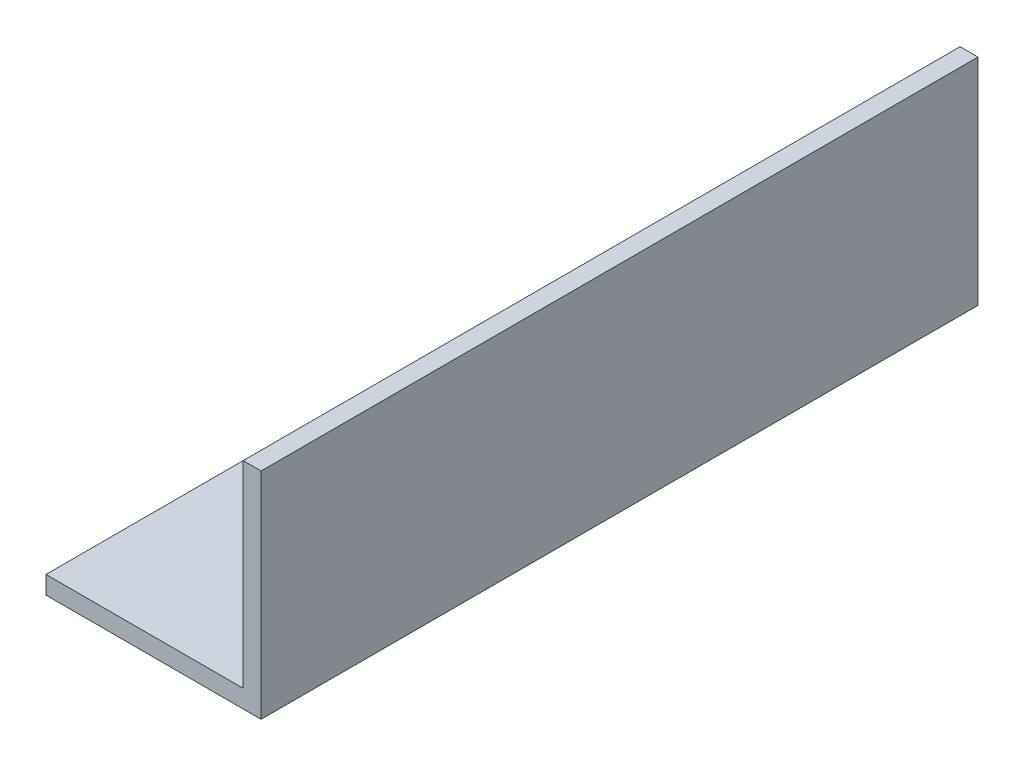
ISO-10303-21;
HEADER;
FILE_DESCRIPTION(('STEP AP214'),'2;1');
FILE_NAME('part.step','',(''),(''),'','','');
FILE_SCHEMA(('AUTOMOTIVE_DESIGN { 1 0 10303 214 1 1 1 1 }'));
ENDSEC;
DATA;
#1=APPLICATION_CONTEXT('core data for automotive mechanical design processes');
#2=APPLICATION_PROTOCOL_DEFINITION('international standard','automotive_design',2000,#1);
#3=PRODUCT_CONTEXT('',#1,'mechanical');
#4=PRODUCT('Part','Part','',(#3));
#5=PRODUCT_RELATED_PRODUCT_CATEGORY('part','',(#4));
#6=PRODUCT_DEFINITION_FORMATION('','',#4);
#7=PRODUCT_DEFINITION_CONTEXT('part definition',#1,'design');
#8=PRODUCT_DEFINITION('design','',#6,#7);
#9=PRODUCT_DEFINITION_SHAPE('','',#8);
#10=(LENGTH_UNIT() NAMED_UNIT(*) SI_UNIT(.MILLI.,.METRE.));
#11=(NAMED_UNIT(*) PLANE_ANGLE_UNIT() SI_UNIT($,.RADIAN.));
#12=(NAMED_UNIT(*) SI_UNIT($,.STERADIAN.) SOLID_ANGLE_UNIT());
#13=UNCERTAINTY_MEASURE_WITH_UNIT(LENGTH_MEASURE(1.E-05),#10,'distance_accuracy_value','');
#14=(GEOMETRIC_REPRESENTATION_CONTEXT(3) GLOBAL_UNCERTAINTY_ASSIGNED_CONTEXT((#13)) GLOBAL_UNIT_ASSIGNED_CONTEXT((#10,
#11,#12)) REPRESENTATION_CONTEXT('',''));
#15=CARTESIAN_POINT('',(0.,0.,0.));
#16=DIRECTION('',(0.,0.,1.));
#17=DIRECTION('',(1.,0.,0.));
#18=AXIS2_PLACEMENT_3D('',#15,#16,#17);
#19=CARTESIAN_POINT('',(0.,0.,127.));
#20=DIRECTION('',(1.,0.,0.));
#21=DIRECTION('',(0.,0.,-1.));
#22=AXIS2_PLACEMENT_3D('',#19,#20,#21);
#23=PLANE('',#22);
#24=DIRECTION('',(0.,-1.,0.));
#25=VECTOR('',#24,1.);
#26=CARTESIAN_POINT('',(0.,0.,127.));
#27=LINE('',#26,#25);
#28=CARTESIAN_POINT('',(0.,3.175,127.));
#29=VERTEX_POINT('',#28);
#30=CARTESIAN_POINT('',(0.,0.,127.));
#31=VERTEX_POINT('',#30);
#32=EDGE_CURVE('E78',#29,#31,#27,.T.);
#33=ORIENTED_EDGE('',*,*,#32,.F.);
#34=DIRECTION('',(0.,0.,1.));
#35=VECTOR('',#34,1.);
#36=CARTESIAN_POINT('',(0.,3.175,0.));
#37=LINE('',#36,#35);
#38=CARTESIAN_POINT('',(0.,3.175,0.));
#39=VERTEX_POINT('',#38);
#40=EDGE_CURVE('E98',#39,#29,#37,.T.);
#41=ORIENTED_EDGE('',*,*,#40,.F.);
#42=DIRECTION('',(0.,-1.,0.));
#43=VECTOR('',#42,1.);
#44=CARTESIAN_POINT('',(0.,0.,0.));
#45=LINE('',#44,#43);
#46=CARTESIAN_POINT('',(0.,0.,0.));
#47=VERTEX_POINT('',#46);
#48=EDGE_CURVE('E106',#39,#47,#45,.T.);
#49=ORIENTED_EDGE('',*,*,#48,.T.);
#50=DIRECTION('',(0.,0.,-1.));
#51=VECTOR('',#50,1.);
#52=CARTESIAN_POINT('',(0.,0.,127.));
#53=LINE('',#52,#51);
#54=EDGE_CURVE('E11',#31,#47,#53,.T.);
#55=ORIENTED_EDGE('',*,*,#54,.F.);
#56=EDGE_LOOP('',(#33,#41,#49,#55));
#57=FACE_BOUND('',#56,.T.);
#58=ADVANCED_FACE('F33',(#57),#23,.F.);
#59=CARTESIAN_POINT('',(0.,0.,127.));
#60=DIRECTION('',(0.,1.,0.));
#61=DIRECTION('',(0.,0.,1.));
#62=AXIS2_PLACEMENT_3D('',#59,#60,#61);
#63=PLANE('',#62);
#64=DIRECTION('',(1.,0.,0.));
#65=VECTOR('',#64,1.);
#66=CARTESIAN_POINT('',(0.,0.,0.));
#67=LINE('',#66,#65);
#68=CARTESIAN_POINT('',(38.1,0.,0.));
#69=VERTEX_POINT('',#68);
#70=EDGE_CURVE('E110',#47,#69,#67,.T.);
#71=ORIENTED_EDGE('',*,*,#70,.T.);
#72=DIRECTION('',(0.,0.,-1.));
#73=VECTOR('',#72,1.);
#74=CARTESIAN_POINT('',(38.1,0.,127.));
#75=LINE('',#74,#73);
#76=CARTESIAN_POINT('',(38.1,0.,127.));
#77=VERTEX_POINT('',#76);
#78=EDGE_CURVE('E40',#77,#69,#75,.T.);
#79=ORIENTED_EDGE('',*,*,#78,.F.);
#80=DIRECTION('',(1.,0.,0.));
#81=VECTOR('',#80,1.);
#82=CARTESIAN_POINT('',(0.,0.,127.));
#83=LINE('',#82,#81);
#84=EDGE_CURVE('E133',#31,#77,#83,.T.);
#85=ORIENTED_EDGE('',*,*,#84,.F.);
#86=ORIENTED_EDGE('',*,*,#54,.T.);
#87=EDGE_LOOP('',(#71,#79,#85,#86));
#88=FACE_BOUND('',#87,.T.);
#89=ADVANCED_FACE('F152',(#88),#63,.F.);
#90=CARTESIAN_POINT('',(38.1,0.,127.));
#91=DIRECTION('',(-1.,0.,0.));
#92=DIRECTION('',(0.,0.,1.));
#93=AXIS2_PLACEMENT_3D('',#90,#91,#92);
#94=PLANE('',#93);
#95=DIRECTION('',(0.,1.,0.));
#96=VECTOR('',#95,1.);
#97=CARTESIAN_POINT('',(38.1,0.,0.));
#98=LINE('',#97,#96);
#99=CARTESIAN_POINT('',(38.1,38.1,0.));
#100=VERTEX_POINT('',#99);
#101=EDGE_CURVE('E73',#69,#100,#98,.T.);
#102=ORIENTED_EDGE('',*,*,#101,.T.);
#103=DIRECTION('',(0.,0.,-1.));
#104=VECTOR('',#103,1.);
#105=CARTESIAN_POINT('',(38.1,38.1,127.));
#106=LINE('',#105,#104);
#107=CARTESIAN_POINT('',(38.1,38.1,127.));
#108=VERTEX_POINT('',#107);
#109=EDGE_CURVE('E124',#108,#100,#106,.T.);
#110=ORIENTED_EDGE('',*,*,#109,.F.);
#111=DIRECTION('',(0.,1.,0.));
#112=VECTOR('',#111,1.);
#113=CARTESIAN_POINT('',(38.1,0.,127.));
#114=LINE('',#113,#112);
#115=EDGE_CURVE('E56',#77,#108,#114,.T.);
#116=ORIENTED_EDGE('',*,*,#115,.F.);
#117=ORIENTED_EDGE('',*,*,#78,.T.);
#118=EDGE_LOOP('',(#102,#110,#116,#117));
#119=FACE_BOUND('',#118,.T.);
#120=ADVANCED_FACE('F126',(#119),#94,.F.);
#121=CARTESIAN_POINT('',(0.,38.1,127.));
#122=DIRECTION('',(0.,-1.,0.));
#123=DIRECTION('',(0.,0.,-1.));
#124=AXIS2_PLACEMENT_3D('',#121,#122,#123);
#125=PLANE('',#124);
#126=DIRECTION('',(-1.,0.,0.));
#127=VECTOR('',#126,1.);
#128=CARTESIAN_POINT('',(0.,38.1,0.));
#129=LINE('',#128,#127);
#130=CARTESIAN_POINT('',(34.925,38.1,0.));
#131=VERTEX_POINT('',#130);
#132=EDGE_CURVE('E121',#100,#131,#129,.T.);
#133=ORIENTED_EDGE('',*,*,#132,.T.);
#134=DIRECTION('',(0.,0.,1.));
#135=VECTOR('',#134,1.);
#136=CARTESIAN_POINT('',(34.925,38.1,0.));
#137=LINE('',#136,#135);
#138=CARTESIAN_POINT('',(34.925,38.1,127.));
#139=VERTEX_POINT('',#138);
#140=EDGE_CURVE('E111',#131,#139,#137,.T.);
#141=ORIENTED_EDGE('',*,*,#140,.T.);
#142=DIRECTION('',(-1.,0.,0.));
#143=VECTOR('',#142,1.);
#144=CARTESIAN_POINT('',(0.,38.1,127.));
#145=LINE('',#144,#143);
#146=EDGE_CURVE('E117',#108,#139,#145,.T.);
#147=ORIENTED_EDGE('',*,*,#146,.F.);
#148=ORIENTED_EDGE('',*,*,#109,.T.);
#149=EDGE_LOOP('',(#133,#141,#147,#148));
#150=FACE_BOUND('',#149,.T.);
#151=ADVANCED_FACE('F130',(#150),#125,.F.);
#152=CARTESIAN_POINT('',(0.,0.,127.));
#153=DIRECTION('',(0.,0.,-1.));
#154=DIRECTION('',(-1.,0.,0.));
#155=AXIS2_PLACEMENT_3D('',#152,#153,#154);
#156=PLANE('',#155);
#157=ORIENTED_EDGE('',*,*,#146,.T.);
#158=DIRECTION('',(0.,1.,0.));
#159=VECTOR('',#158,1.);
#160=CARTESIAN_POINT('',(34.925,38.1,127.));
#161=LINE('',#160,#159);
#162=CARTESIAN_POINT('',(34.925,3.175,127.));
#163=VERTEX_POINT('',#162);
#164=EDGE_CURVE('E102',#163,#139,#161,.T.);
#165=ORIENTED_EDGE('',*,*,#164,.F.);
#166=DIRECTION('',(1.,0.,0.));
#167=VECTOR('',#166,1.);
#168=CARTESIAN_POINT('',(0.,3.175,127.));
#169=LINE('',#168,#167);
#170=EDGE_CURVE('E139',#29,#163,#169,.T.);
#171=ORIENTED_EDGE('',*,*,#170,.F.);
#172=ORIENTED_EDGE('',*,*,#32,.T.);
#173=ORIENTED_EDGE('',*,*,#84,.T.);
#174=ORIENTED_EDGE('',*,*,#115,.T.);
#175=EDGE_LOOP('',(#157,#165,#171,#172,#173,#174));
#176=FACE_BOUND('',#175,.T.);
#177=ADVANCED_FACE('F141',(#176),#156,.F.);
#178=CARTESIAN_POINT('',(0.,0.,0.));
#179=DIRECTION('',(0.,0.,-1.));
#180=DIRECTION('',(-1.,0.,0.));
#181=AXIS2_PLACEMENT_3D('',#178,#179,#180);
#182=PLANE('',#181);
#183=DIRECTION('',(0.,1.,0.));
#184=VECTOR('',#183,1.);
#185=CARTESIAN_POINT('',(34.925,38.1,0.));
#186=LINE('',#185,#184);
#187=CARTESIAN_POINT('',(34.925,3.175,0.));
#188=VERTEX_POINT('',#187);
#189=EDGE_CURVE('E47',#188,#131,#186,.T.);
#190=ORIENTED_EDGE('',*,*,#189,.T.);
#191=ORIENTED_EDGE('',*,*,#132,.F.);
#192=ORIENTED_EDGE('',*,*,#101,.F.);
#193=ORIENTED_EDGE('',*,*,#70,.F.);
#194=ORIENTED_EDGE('',*,*,#48,.F.);
#195=DIRECTION('',(1.,0.,0.));
#196=VECTOR('',#195,1.);
#197=CARTESIAN_POINT('',(0.,3.175,0.));
#198=LINE('',#197,#196);
#199=EDGE_CURVE('E94',#39,#188,#198,.T.);
#200=ORIENTED_EDGE('',*,*,#199,.T.);
#201=EDGE_LOOP('',(#190,#191,#192,#193,#194,#200));
#202=FACE_BOUND('',#201,.T.);
#203=ADVANCED_FACE('F109',(#202),#182,.T.);
#204=CARTESIAN_POINT('',(34.925,38.1,0.));
#205=DIRECTION('',(1.,0.,0.));
#206=DIRECTION('',(0.,1.,0.));
#207=AXIS2_PLACEMENT_3D('',#204,#205,#206);
#208=PLANE('',#207);
#209=ORIENTED_EDGE('',*,*,#164,.T.);
#210=ORIENTED_EDGE('',*,*,#140,.F.);
#211=ORIENTED_EDGE('',*,*,#189,.F.);
#212=DIRECTION('',(0.,0.,1.));
#213=VECTOR('',#212,1.);
#214=CARTESIAN_POINT('',(34.925,3.175,0.));
#215=LINE('',#214,#213);
#216=EDGE_CURVE('E99',#188,#163,#215,.T.);
#217=ORIENTED_EDGE('',*,*,#216,.T.);
#218=EDGE_LOOP('',(#209,#210,#211,#217));
#219=FACE_BOUND('',#218,.T.);
#220=ADVANCED_FACE('F142',(#219),#208,.F.);
#221=CARTESIAN_POINT('',(0.,3.175,0.));
#222=DIRECTION('',(0.,-1.,0.));
#223=DIRECTION('',(0.,0.,-1.));
#224=AXIS2_PLACEMENT_3D('',#221,#222,#223);
#225=PLANE('',#224);
#226=ORIENTED_EDGE('',*,*,#170,.T.);
#227=ORIENTED_EDGE('',*,*,#216,.F.);
#228=ORIENTED_EDGE('',*,*,#199,.F.);
#229=ORIENTED_EDGE('',*,*,#40,.T.);
#230=EDGE_LOOP('',(#226,#227,#228,#229));
#231=FACE_BOUND('',#230,.T.);
#232=ADVANCED_FACE('F97',(#231),#225,.F.);
#233=CLOSED_SHELL('',(#58,#89,#120,#151,#177,#203,#220,#232));
#234=MANIFOLD_SOLID_BREP('B2',#233);
#235=ADVANCED_BREP_SHAPE_REPRESENTATION('',(#18,#234),#14);
#236=SHAPE_DEFINITION_REPRESENTATION(#9,#235);
ENDSEC;
END-ISO-10303-21;
